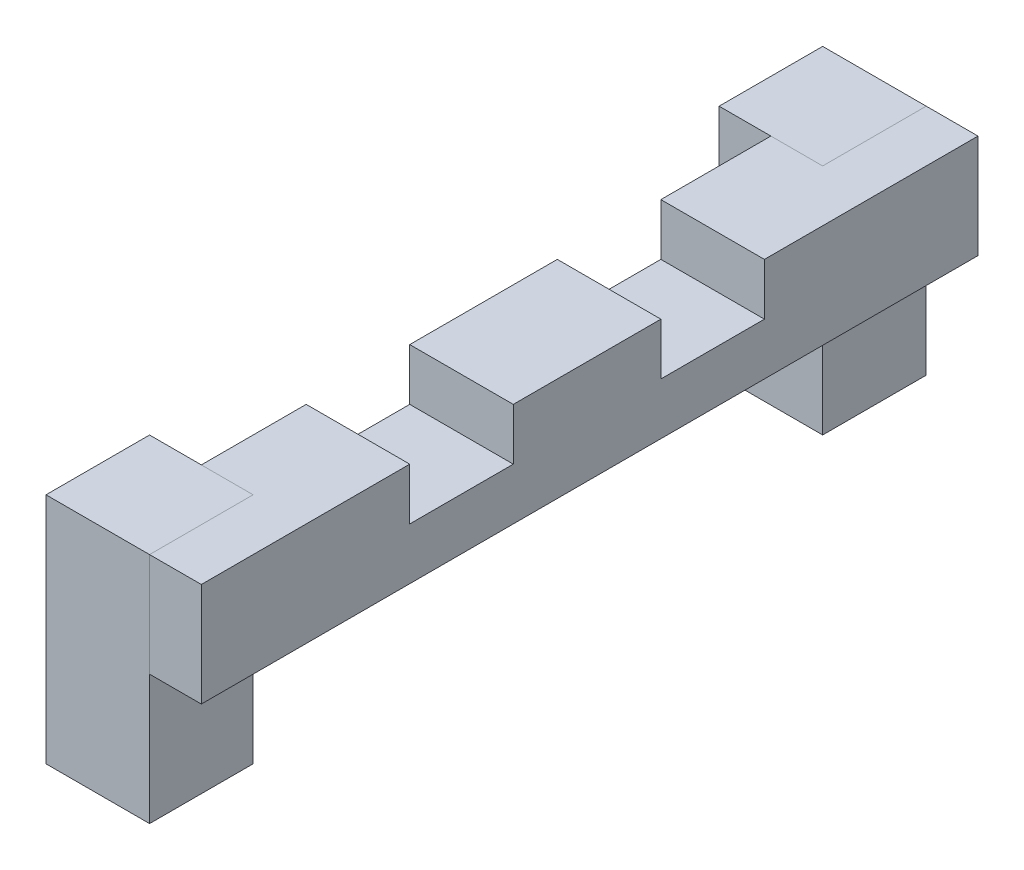
ISO-10303-21;
HEADER;
FILE_DESCRIPTION(('STEP AP214'),'2;1');
FILE_NAME('part.step','',(''),(''),'','','');
FILE_SCHEMA(('AUTOMOTIVE_DESIGN { 1 0 10303 214 1 1 1 1 }'));
ENDSEC;
DATA;
#1=APPLICATION_CONTEXT('core data for automotive mechanical design processes');
#2=APPLICATION_PROTOCOL_DEFINITION('international standard','automotive_design',2000,#1);
#3=PRODUCT_CONTEXT('',#1,'mechanical');
#4=PRODUCT('Part','Part','',(#3));
#5=PRODUCT_RELATED_PRODUCT_CATEGORY('part','',(#4));
#6=PRODUCT_DEFINITION_FORMATION('','',#4);
#7=PRODUCT_DEFINITION_CONTEXT('part definition',#1,'design');
#8=PRODUCT_DEFINITION('design','',#6,#7);
#9=PRODUCT_DEFINITION_SHAPE('','',#8);
#10=(LENGTH_UNIT() NAMED_UNIT(*) SI_UNIT(.MILLI.,.METRE.));
#11=(NAMED_UNIT(*) PLANE_ANGLE_UNIT() SI_UNIT($,.RADIAN.));
#12=(NAMED_UNIT(*) SI_UNIT($,.STERADIAN.) SOLID_ANGLE_UNIT());
#13=UNCERTAINTY_MEASURE_WITH_UNIT(LENGTH_MEASURE(1.E-05),#10,'distance_accuracy_value','');
#14=(GEOMETRIC_REPRESENTATION_CONTEXT(3) GLOBAL_UNCERTAINTY_ASSIGNED_CONTEXT((#13)) GLOBAL_UNIT_ASSIGNED_CONTEXT((#10,
#11,#12)) REPRESENTATION_CONTEXT('',''));
#15=CARTESIAN_POINT('',(0.,0.,0.));
#16=DIRECTION('',(0.,0.,1.));
#17=DIRECTION('',(1.,0.,0.));
#18=AXIS2_PLACEMENT_3D('',#15,#16,#17);
#19=CARTESIAN_POINT('',(-20.,-50.,40.));
#20=DIRECTION('',(-1.,0.,0.));
#21=DIRECTION('',(0.,0.,1.));
#22=AXIS2_PLACEMENT_3D('',#19,#20,#21);
#23=PLANE('',#22);
#24=DIRECTION('',(0.,1.,0.));
#25=VECTOR('',#24,1.);
#26=CARTESIAN_POINT('',(-20.,-50.,0.));
#27=LINE('',#26,#25);
#28=CARTESIAN_POINT('',(-20.,-50.,0.));
#29=VERTEX_POINT('',#28);
#30=CARTESIAN_POINT('',(-20.,40.,0.));
#31=VERTEX_POINT('',#30);
#32=EDGE_CURVE('E107',#29,#31,#27,.T.);
#33=ORIENTED_EDGE('',*,*,#32,.F.);
#34=DIRECTION('',(0.,0.,-1.));
#35=VECTOR('',#34,1.);
#36=CARTESIAN_POINT('',(-20.,-50.,40.));
#37=LINE('',#36,#35);
#38=CARTESIAN_POINT('',(-20.,-50.,40.));
#39=VERTEX_POINT('',#38);
#40=EDGE_CURVE('E12',#39,#29,#37,.T.);
#41=ORIENTED_EDGE('',*,*,#40,.F.);
#42=DIRECTION('',(0.,1.,0.));
#43=VECTOR('',#42,1.);
#44=CARTESIAN_POINT('',(-20.,-50.,40.));
#45=LINE('',#44,#43);
#46=CARTESIAN_POINT('',(-20.,40.,40.));
#47=VERTEX_POINT('',#46);
#48=EDGE_CURVE('E101',#39,#47,#45,.T.);
#49=ORIENTED_EDGE('',*,*,#48,.T.);
#50=DIRECTION('',(0.,0.,-1.));
#51=VECTOR('',#50,1.);
#52=CARTESIAN_POINT('',(-20.,40.,40.));
#53=LINE('',#52,#51);
#54=EDGE_CURVE('E46',#47,#31,#53,.T.);
#55=ORIENTED_EDGE('',*,*,#54,.T.);
#56=EDGE_LOOP('',(#33,#41,#49,#55));
#57=FACE_BOUND('',#56,.T.);
#58=ADVANCED_FACE('F43',(#57),#23,.T.);
#59=CARTESIAN_POINT('',(20.,-50.,40.));
#60=DIRECTION('',(0.,-1.,0.));
#61=DIRECTION('',(0.,0.,-1.));
#62=AXIS2_PLACEMENT_3D('',#59,#60,#61);
#63=PLANE('',#62);
#64=DIRECTION('',(-1.,0.,0.));
#65=VECTOR('',#64,1.);
#66=CARTESIAN_POINT('',(20.,-50.,0.));
#67=LINE('',#66,#65);
#68=CARTESIAN_POINT('',(20.,-50.,0.));
#69=VERTEX_POINT('',#68);
#70=EDGE_CURVE('E103',#69,#29,#67,.T.);
#71=ORIENTED_EDGE('',*,*,#70,.F.);
#72=DIRECTION('',(0.,0.,-1.));
#73=VECTOR('',#72,1.);
#74=CARTESIAN_POINT('',(20.,-50.,40.));
#75=LINE('',#74,#73);
#76=CARTESIAN_POINT('',(20.,-50.,40.));
#77=VERTEX_POINT('',#76);
#78=EDGE_CURVE('E52',#77,#69,#75,.T.);
#79=ORIENTED_EDGE('',*,*,#78,.F.);
#80=DIRECTION('',(-1.,0.,0.));
#81=VECTOR('',#80,1.);
#82=CARTESIAN_POINT('',(20.,-50.,40.));
#83=LINE('',#82,#81);
#84=EDGE_CURVE('E98',#77,#39,#83,.T.);
#85=ORIENTED_EDGE('',*,*,#84,.T.);
#86=ORIENTED_EDGE('',*,*,#40,.T.);
#87=EDGE_LOOP('',(#71,#79,#85,#86));
#88=FACE_BOUND('',#87,.T.);
#89=ADVANCED_FACE('F117',(#88),#63,.T.);
#90=CARTESIAN_POINT('',(20.,40.,40.));
#91=DIRECTION('',(1.,0.,0.));
#92=DIRECTION('',(0.,1.,0.));
#93=AXIS2_PLACEMENT_3D('',#90,#91,#92);
#94=PLANE('',#93);
#95=DIRECTION('',(0.,-1.,0.));
#96=VECTOR('',#95,1.);
#97=CARTESIAN_POINT('',(20.,40.,0.));
#98=LINE('',#97,#96);
#99=CARTESIAN_POINT('',(20.,40.,0.));
#100=VERTEX_POINT('',#99);
#101=EDGE_CURVE('E93',#100,#69,#98,.T.);
#102=ORIENTED_EDGE('',*,*,#101,.F.);
#103=DIRECTION('',(0.,0.,-1.));
#104=VECTOR('',#103,1.);
#105=CARTESIAN_POINT('',(20.,40.,40.));
#106=LINE('',#105,#104);
#107=CARTESIAN_POINT('',(20.,40.,40.));
#108=VERTEX_POINT('',#107);
#109=EDGE_CURVE('E88',#108,#100,#106,.T.);
#110=ORIENTED_EDGE('',*,*,#109,.F.);
#111=DIRECTION('',(0.,-1.,0.));
#112=VECTOR('',#111,1.);
#113=CARTESIAN_POINT('',(20.,40.,40.));
#114=LINE('',#113,#112);
#115=EDGE_CURVE('E91',#108,#77,#114,.T.);
#116=ORIENTED_EDGE('',*,*,#115,.T.);
#117=ORIENTED_EDGE('',*,*,#78,.T.);
#118=EDGE_LOOP('',(#102,#110,#116,#117));
#119=FACE_BOUND('',#118,.T.);
#120=ADVANCED_FACE('F90',(#119),#94,.T.);
#121=CARTESIAN_POINT('',(-20.,40.,40.));
#122=DIRECTION('',(0.,1.,0.));
#123=DIRECTION('',(0.,0.,1.));
#124=AXIS2_PLACEMENT_3D('',#121,#122,#123);
#125=PLANE('',#124);
#126=DIRECTION('',(1.,0.,0.));
#127=VECTOR('',#126,1.);
#128=CARTESIAN_POINT('',(-20.,40.,0.));
#129=LINE('',#128,#127);
#130=EDGE_CURVE('E110',#31,#100,#129,.T.);
#131=ORIENTED_EDGE('',*,*,#130,.F.);
#132=ORIENTED_EDGE('',*,*,#54,.F.);
#133=DIRECTION('',(1.,0.,0.));
#134=VECTOR('',#133,1.);
#135=CARTESIAN_POINT('',(-20.,40.,40.));
#136=LINE('',#135,#134);
#137=EDGE_CURVE('E97',#47,#108,#136,.T.);
#138=ORIENTED_EDGE('',*,*,#137,.T.);
#139=ORIENTED_EDGE('',*,*,#109,.T.);
#140=EDGE_LOOP('',(#131,#132,#138,#139));
#141=FACE_BOUND('',#140,.T.);
#142=ADVANCED_FACE('F100',(#141),#125,.T.);
#143=CARTESIAN_POINT('',(0.,0.,40.));
#144=DIRECTION('',(0.,0.,-1.));
#145=DIRECTION('',(-1.,0.,0.));
#146=AXIS2_PLACEMENT_3D('',#143,#144,#145);
#147=PLANE('',#146);
#148=ORIENTED_EDGE('',*,*,#48,.F.);
#149=ORIENTED_EDGE('',*,*,#84,.F.);
#150=ORIENTED_EDGE('',*,*,#115,.F.);
#151=ORIENTED_EDGE('',*,*,#137,.F.);
#152=EDGE_LOOP('',(#148,#149,#150,#151));
#153=FACE_BOUND('',#152,.T.);
#154=ADVANCED_FACE('F96',(#153),#147,.F.);
#155=CARTESIAN_POINT('',(0.,0.,0.));
#156=DIRECTION('',(0.,0.,-1.));
#157=DIRECTION('',(-1.,0.,0.));
#158=AXIS2_PLACEMENT_3D('',#155,#156,#157);
#159=PLANE('',#158);
#160=ORIENTED_EDGE('',*,*,#32,.T.);
#161=ORIENTED_EDGE('',*,*,#130,.T.);
#162=ORIENTED_EDGE('',*,*,#101,.T.);
#163=ORIENTED_EDGE('',*,*,#70,.T.);
#164=EDGE_LOOP('',(#160,#161,#162,#163));
#165=FACE_BOUND('',#164,.T.);
#166=ADVANCED_FACE('F116',(#165),#159,.T.);
#167=CLOSED_SHELL('',(#58,#89,#120,#142,#154,#166));
#168=MANIFOLD_SOLID_BREP('B2',#167);
#169=CARTESIAN_POINT('',(-20.,40.,260.));
#170=DIRECTION('',(0.,1.,0.));
#171=DIRECTION('',(0.,0.,1.));
#172=AXIS2_PLACEMENT_3D('',#169,#170,#171);
#173=PLANE('',#172);
#174=DIRECTION('',(-1.,0.,0.));
#175=VECTOR('',#174,1.);
#176=CARTESIAN_POINT('',(-20.,40.,300.));
#177=LINE('',#176,#175);
#178=CARTESIAN_POINT('',(20.,40.,300.));
#179=VERTEX_POINT('',#178);
#180=CARTESIAN_POINT('',(-20.,40.,300.));
#181=VERTEX_POINT('',#180);
#182=EDGE_CURVE('E239',#179,#181,#177,.T.);
#183=ORIENTED_EDGE('',*,*,#182,.F.);
#184=DIRECTION('',(0.,0.,1.));
#185=VECTOR('',#184,1.);
#186=CARTESIAN_POINT('',(20.,40.,260.));
#187=LINE('',#186,#185);
#188=CARTESIAN_POINT('',(20.,40.,260.));
#189=VERTEX_POINT('',#188);
#190=EDGE_CURVE('E41',#189,#179,#187,.T.);
#191=ORIENTED_EDGE('',*,*,#190,.F.);
#192=DIRECTION('',(-1.,0.,0.));
#193=VECTOR('',#192,1.);
#194=CARTESIAN_POINT('',(-20.,40.,260.));
#195=LINE('',#194,#193);
#196=CARTESIAN_POINT('',(-20.,40.,260.));
#197=VERTEX_POINT('',#196);
#198=EDGE_CURVE('E233',#189,#197,#195,.T.);
#199=ORIENTED_EDGE('',*,*,#198,.T.);
#200=DIRECTION('',(0.,0.,1.));
#201=VECTOR('',#200,1.);
#202=CARTESIAN_POINT('',(-20.,40.,260.));
#203=LINE('',#202,#201);
#204=EDGE_CURVE('E178',#197,#181,#203,.T.);
#205=ORIENTED_EDGE('',*,*,#204,.T.);
#206=EDGE_LOOP('',(#183,#191,#199,#205));
#207=FACE_BOUND('',#206,.T.);
#208=ADVANCED_FACE('F175',(#207),#173,.T.);
#209=CARTESIAN_POINT('',(20.,40.,260.));
#210=DIRECTION('',(1.,0.,0.));
#211=DIRECTION('',(0.,1.,0.));
#212=AXIS2_PLACEMENT_3D('',#209,#210,#211);
#213=PLANE('',#212);
#214=DIRECTION('',(0.,1.,0.));
#215=VECTOR('',#214,1.);
#216=CARTESIAN_POINT('',(20.,40.,300.));
#217=LINE('',#216,#215);
#218=CARTESIAN_POINT('',(20.,-50.,300.));
#219=VERTEX_POINT('',#218);
#220=EDGE_CURVE('E235',#219,#179,#217,.T.);
#221=ORIENTED_EDGE('',*,*,#220,.F.);
#222=DIRECTION('',(0.,0.,1.));
#223=VECTOR('',#222,1.);
#224=CARTESIAN_POINT('',(20.,-50.,260.));
#225=LINE('',#224,#223);
#226=CARTESIAN_POINT('',(20.,-50.,260.));
#227=VERTEX_POINT('',#226);
#228=EDGE_CURVE('E184',#227,#219,#225,.T.);
#229=ORIENTED_EDGE('',*,*,#228,.F.);
#230=DIRECTION('',(0.,1.,0.));
#231=VECTOR('',#230,1.);
#232=CARTESIAN_POINT('',(20.,40.,260.));
#233=LINE('',#232,#231);
#234=EDGE_CURVE('E230',#227,#189,#233,.T.);
#235=ORIENTED_EDGE('',*,*,#234,.T.);
#236=ORIENTED_EDGE('',*,*,#190,.T.);
#237=EDGE_LOOP('',(#221,#229,#235,#236));
#238=FACE_BOUND('',#237,.T.);
#239=ADVANCED_FACE('F249',(#238),#213,.T.);
#240=CARTESIAN_POINT('',(20.,-50.,260.));
#241=DIRECTION('',(0.,-1.,0.));
#242=DIRECTION('',(0.,0.,-1.));
#243=AXIS2_PLACEMENT_3D('',#240,#241,#242);
#244=PLANE('',#243);
#245=DIRECTION('',(1.,0.,0.));
#246=VECTOR('',#245,1.);
#247=CARTESIAN_POINT('',(20.,-50.,300.));
#248=LINE('',#247,#246);
#249=CARTESIAN_POINT('',(-20.,-50.,300.));
#250=VERTEX_POINT('',#249);
#251=EDGE_CURVE('E225',#250,#219,#248,.T.);
#252=ORIENTED_EDGE('',*,*,#251,.F.);
#253=DIRECTION('',(0.,0.,1.));
#254=VECTOR('',#253,1.);
#255=CARTESIAN_POINT('',(-20.,-50.,260.));
#256=LINE('',#255,#254);
#257=CARTESIAN_POINT('',(-20.,-50.,260.));
#258=VERTEX_POINT('',#257);
#259=EDGE_CURVE('E220',#258,#250,#256,.T.);
#260=ORIENTED_EDGE('',*,*,#259,.F.);
#261=DIRECTION('',(1.,0.,0.));
#262=VECTOR('',#261,1.);
#263=CARTESIAN_POINT('',(20.,-50.,260.));
#264=LINE('',#263,#262);
#265=EDGE_CURVE('E223',#258,#227,#264,.T.);
#266=ORIENTED_EDGE('',*,*,#265,.T.);
#267=ORIENTED_EDGE('',*,*,#228,.T.);
#268=EDGE_LOOP('',(#252,#260,#266,#267));
#269=FACE_BOUND('',#268,.T.);
#270=ADVANCED_FACE('F222',(#269),#244,.T.);
#271=CARTESIAN_POINT('',(-20.,-50.,260.));
#272=DIRECTION('',(-1.,0.,0.));
#273=DIRECTION('',(0.,0.,1.));
#274=AXIS2_PLACEMENT_3D('',#271,#272,#273);
#275=PLANE('',#274);
#276=DIRECTION('',(0.,-1.,0.));
#277=VECTOR('',#276,1.);
#278=CARTESIAN_POINT('',(-20.,-50.,300.));
#279=LINE('',#278,#277);
#280=EDGE_CURVE('E242',#181,#250,#279,.T.);
#281=ORIENTED_EDGE('',*,*,#280,.F.);
#282=ORIENTED_EDGE('',*,*,#204,.F.);
#283=DIRECTION('',(0.,-1.,0.));
#284=VECTOR('',#283,1.);
#285=CARTESIAN_POINT('',(-20.,-50.,260.));
#286=LINE('',#285,#284);
#287=EDGE_CURVE('E229',#197,#258,#286,.T.);
#288=ORIENTED_EDGE('',*,*,#287,.T.);
#289=ORIENTED_EDGE('',*,*,#259,.T.);
#290=EDGE_LOOP('',(#281,#282,#288,#289));
#291=FACE_BOUND('',#290,.T.);
#292=ADVANCED_FACE('F232',(#291),#275,.T.);
#293=CARTESIAN_POINT('',(0.,0.,260.));
#294=DIRECTION('',(0.,0.,-1.));
#295=DIRECTION('',(-1.,0.,0.));
#296=AXIS2_PLACEMENT_3D('',#293,#294,#295);
#297=PLANE('',#296);
#298=ORIENTED_EDGE('',*,*,#198,.F.);
#299=ORIENTED_EDGE('',*,*,#234,.F.);
#300=ORIENTED_EDGE('',*,*,#265,.F.);
#301=ORIENTED_EDGE('',*,*,#287,.F.);
#302=EDGE_LOOP('',(#298,#299,#300,#301));
#303=FACE_BOUND('',#302,.T.);
#304=ADVANCED_FACE('F228',(#303),#297,.T.);
#305=CARTESIAN_POINT('',(0.,0.,300.));
#306=DIRECTION('',(0.,0.,-1.));
#307=DIRECTION('',(-1.,0.,0.));
#308=AXIS2_PLACEMENT_3D('',#305,#306,#307);
#309=PLANE('',#308);
#310=ORIENTED_EDGE('',*,*,#182,.T.);
#311=ORIENTED_EDGE('',*,*,#280,.T.);
#312=ORIENTED_EDGE('',*,*,#251,.T.);
#313=ORIENTED_EDGE('',*,*,#220,.T.);
#314=EDGE_LOOP('',(#310,#311,#312,#313));
#315=FACE_BOUND('',#314,.T.);
#316=ADVANCED_FACE('F248',(#315),#309,.F.);
#317=CLOSED_SHELL('',(#208,#239,#270,#292,#304,#316));
#318=MANIFOLD_SOLID_BREP('B6',#317);
#319=CARTESIAN_POINT('',(0.,40.,0.));
#320=DIRECTION('',(1.,0.,0.));
#321=DIRECTION('',(0.,0.,-1.));
#322=AXIS2_PLACEMENT_3D('',#319,#320,#321);
#323=PLANE('',#322);
#324=DIRECTION('',(0.,1.,0.));
#325=VECTOR('',#324,1.);
#326=CARTESIAN_POINT('',(0.,0.,40.));
#327=LINE('',#326,#325);
#328=CARTESIAN_POINT('',(0.,0.,40.));
#329=VERTEX_POINT('',#328);
#330=CARTESIAN_POINT('',(0.,40.,40.));
#331=VERTEX_POINT('',#330);
#332=EDGE_CURVE('E409',#329,#331,#327,.T.);
#333=ORIENTED_EDGE('',*,*,#332,.F.);
#334=DIRECTION('',(0.,0.,1.));
#335=VECTOR('',#334,1.);
#336=CARTESIAN_POINT('',(0.,0.,0.));
#337=LINE('',#336,#335);
#338=CARTESIAN_POINT('',(0.,0.,260.));
#339=VERTEX_POINT('',#338);
#340=EDGE_CURVE('E320',#329,#339,#337,.T.);
#341=ORIENTED_EDGE('',*,*,#340,.T.);
#342=DIRECTION('',(0.,-1.,0.));
#343=VECTOR('',#342,1.);
#344=CARTESIAN_POINT('',(0.,40.,260.));
#345=LINE('',#344,#343);
#346=CARTESIAN_POINT('',(0.,40.,260.));
#347=VERTEX_POINT('',#346);
#348=EDGE_CURVE('E483',#347,#339,#345,.T.);
#349=ORIENTED_EDGE('',*,*,#348,.F.);
#350=DIRECTION('',(0.,0.,1.));
#351=VECTOR('',#350,1.);
#352=CARTESIAN_POINT('',(0.,40.,0.));
#353=LINE('',#352,#351);
#354=CARTESIAN_POINT('',(0.,40.,219.5));
#355=VERTEX_POINT('',#354);
#356=EDGE_CURVE('E433',#355,#347,#353,.T.);
#357=ORIENTED_EDGE('',*,*,#356,.F.);
#358=DIRECTION('',(0.,1.,0.));
#359=VECTOR('',#358,1.);
#360=CARTESIAN_POINT('',(0.,20.,219.5));
#361=LINE('',#360,#359);
#362=CARTESIAN_POINT('',(0.,20.,219.5));
#363=VERTEX_POINT('',#362);
#364=EDGE_CURVE('E540',#363,#355,#361,.T.);
#365=ORIENTED_EDGE('',*,*,#364,.F.);
#366=DIRECTION('',(0.,0.,1.));
#367=VECTOR('',#366,1.);
#368=CARTESIAN_POINT('',(0.,20.,179.5));
#369=LINE('',#368,#367);
#370=CARTESIAN_POINT('',(0.,20.,179.5));
#371=VERTEX_POINT('',#370);
#372=EDGE_CURVE('E528',#371,#363,#369,.T.);
#373=ORIENTED_EDGE('',*,*,#372,.F.);
#374=DIRECTION('',(0.,1.,0.));
#375=VECTOR('',#374,1.);
#376=CARTESIAN_POINT('',(0.,20.,179.5));
#377=LINE('',#376,#375);
#378=CARTESIAN_POINT('',(0.,40.,179.5));
#379=VERTEX_POINT('',#378);
#380=EDGE_CURVE('E519',#371,#379,#377,.T.);
#381=ORIENTED_EDGE('',*,*,#380,.T.);
#382=CARTESIAN_POINT('',(0.,40.,122.5));
#383=VERTEX_POINT('',#382);
#384=EDGE_CURVE('E431',#383,#379,#353,.T.);
#385=ORIENTED_EDGE('',*,*,#384,.F.);
#386=DIRECTION('',(0.,1.,0.));
#387=VECTOR('',#386,1.);
#388=CARTESIAN_POINT('',(0.,20.,122.5));
#389=LINE('',#388,#387);
#390=CARTESIAN_POINT('',(0.,20.,122.5));
#391=VERTEX_POINT('',#390);
#392=EDGE_CURVE('E516',#391,#383,#389,.T.);
#393=ORIENTED_EDGE('',*,*,#392,.F.);
#394=DIRECTION('',(0.,0.,1.));
#395=VECTOR('',#394,1.);
#396=CARTESIAN_POINT('',(0.,20.,82.5));
#397=LINE('',#396,#395);
#398=CARTESIAN_POINT('',(0.,20.,82.5));
#399=VERTEX_POINT('',#398);
#400=EDGE_CURVE('E504',#399,#391,#397,.T.);
#401=ORIENTED_EDGE('',*,*,#400,.F.);
#402=DIRECTION('',(0.,1.,0.));
#403=VECTOR('',#402,1.);
#404=CARTESIAN_POINT('',(0.,20.,82.5));
#405=LINE('',#404,#403);
#406=CARTESIAN_POINT('',(0.,40.,82.5));
#407=VERTEX_POINT('',#406);
#408=EDGE_CURVE('E429',#399,#407,#405,.T.);
#409=ORIENTED_EDGE('',*,*,#408,.T.);
#410=EDGE_CURVE('E422',#331,#407,#353,.T.);
#411=ORIENTED_EDGE('',*,*,#410,.F.);
#412=EDGE_LOOP('',(#333,#341,#349,#357,#365,#373,#381,#385,#393,#401,#409,#411));
#413=FACE_BOUND('',#412,.T.);
#414=ADVANCED_FACE('F298',(#413),#323,.F.);
#415=CARTESIAN_POINT('',(0.,40.,0.));
#416=DIRECTION('',(0.,1.,0.));
#417=DIRECTION('',(0.,0.,1.));
#418=AXIS2_PLACEMENT_3D('',#415,#416,#417);
#419=PLANE('',#418);
#420=DIRECTION('',(0.,0.,-1.));
#421=VECTOR('',#420,1.);
#422=CARTESIAN_POINT('',(20.,40.,40.));
#423=LINE('',#422,#421);
#424=CARTESIAN_POINT('',(20.,40.,40.));
#425=VERTEX_POINT('',#424);
#426=CARTESIAN_POINT('',(20.,40.,0.));
#427=VERTEX_POINT('',#426);
#428=EDGE_CURVE('E425',#425,#427,#423,.T.);
#429=ORIENTED_EDGE('',*,*,#428,.F.);
#430=DIRECTION('',(1.,0.,0.));
#431=VECTOR('',#430,1.);
#432=CARTESIAN_POINT('',(0.,40.,40.));
#433=LINE('',#432,#431);
#434=EDGE_CURVE('E412',#331,#425,#433,.T.);
#435=ORIENTED_EDGE('',*,*,#434,.F.);
#436=ORIENTED_EDGE('',*,*,#410,.T.);
#437=DIRECTION('',(-1.,0.,0.));
#438=VECTOR('',#437,1.);
#439=CARTESIAN_POINT('',(0.,40.,82.5));
#440=LINE('',#439,#438);
#441=CARTESIAN_POINT('',(40.,40.,82.5));
#442=VERTEX_POINT('',#441);
#443=EDGE_CURVE('E508',#442,#407,#440,.T.);
#444=ORIENTED_EDGE('',*,*,#443,.F.);
#445=DIRECTION('',(0.,0.,-1.));
#446=VECTOR('',#445,1.);
#447=CARTESIAN_POINT('',(40.,40.,0.));
#448=LINE('',#447,#446);
#449=CARTESIAN_POINT('',(40.,40.,0.));
#450=VERTEX_POINT('',#449);
#451=EDGE_CURVE('E434',#442,#450,#448,.T.);
#452=ORIENTED_EDGE('',*,*,#451,.T.);
#453=DIRECTION('',(-1.,0.,0.));
#454=VECTOR('',#453,1.);
#455=CARTESIAN_POINT('',(0.,40.,0.));
#456=LINE('',#455,#454);
#457=EDGE_CURVE('E454',#450,#427,#456,.T.);
#458=ORIENTED_EDGE('',*,*,#457,.T.);
#459=EDGE_LOOP('',(#429,#435,#436,#444,#452,#458));
#460=FACE_BOUND('',#459,.T.);
#461=ADVANCED_FACE('F420',(#460),#419,.T.);
#462=DIRECTION('',(1.,0.,0.));
#463=VECTOR('',#462,1.);
#464=CARTESIAN_POINT('',(0.,40.,122.5));
#465=LINE('',#464,#463);
#466=CARTESIAN_POINT('',(40.,40.,122.5));
#467=VERTEX_POINT('',#466);
#468=EDGE_CURVE('E517',#383,#467,#465,.T.);
#469=ORIENTED_EDGE('',*,*,#468,.F.);
#470=ORIENTED_EDGE('',*,*,#384,.T.);
#471=DIRECTION('',(-1.,0.,0.));
#472=VECTOR('',#471,1.);
#473=CARTESIAN_POINT('',(0.,40.,179.5));
#474=LINE('',#473,#472);
#475=CARTESIAN_POINT('',(40.,40.,179.5));
#476=VERTEX_POINT('',#475);
#477=EDGE_CURVE('E532',#476,#379,#474,.T.);
#478=ORIENTED_EDGE('',*,*,#477,.F.);
#479=EDGE_CURVE('E460',#476,#467,#448,.T.);
#480=ORIENTED_EDGE('',*,*,#479,.T.);
#481=EDGE_LOOP('',(#469,#470,#478,#480));
#482=FACE_BOUND('',#481,.T.);
#483=ADVANCED_FACE('F574',(#482),#419,.T.);
#484=CARTESIAN_POINT('',(0.,40.,300.));
#485=DIRECTION('',(0.,0.,-1.));
#486=DIRECTION('',(-1.,0.,0.));
#487=AXIS2_PLACEMENT_3D('',#484,#485,#486);
#488=PLANE('',#487);
#489=DIRECTION('',(1.,0.,0.));
#490=VECTOR('',#489,1.);
#491=CARTESIAN_POINT('',(0.,40.,300.));
#492=LINE('',#491,#490);
#493=CARTESIAN_POINT('',(20.,40.,300.));
#494=VERTEX_POINT('',#493);
#495=CARTESIAN_POINT('',(40.,40.,300.));
#496=VERTEX_POINT('',#495);
#497=EDGE_CURVE('E430',#494,#496,#492,.T.);
#498=ORIENTED_EDGE('',*,*,#497,.F.);
#499=DIRECTION('',(0.,1.,0.));
#500=VECTOR('',#499,1.);
#501=CARTESIAN_POINT('',(20.,40.,300.));
#502=LINE('',#501,#500);
#503=CARTESIAN_POINT('',(20.,0.,300.));
#504=VERTEX_POINT('',#503);
#505=EDGE_CURVE('E470',#504,#494,#502,.T.);
#506=ORIENTED_EDGE('',*,*,#505,.F.);
#507=DIRECTION('',(1.,0.,0.));
#508=VECTOR('',#507,1.);
#509=CARTESIAN_POINT('',(0.,0.,300.));
#510=LINE('',#509,#508);
#511=CARTESIAN_POINT('',(40.,0.,300.));
#512=VERTEX_POINT('',#511);
#513=EDGE_CURVE('E451',#504,#512,#510,.T.);
#514=ORIENTED_EDGE('',*,*,#513,.T.);
#515=DIRECTION('',(0.,-1.,0.));
#516=VECTOR('',#515,1.);
#517=CARTESIAN_POINT('',(40.,40.,300.));
#518=LINE('',#517,#516);
#519=EDGE_CURVE('E173',#496,#512,#518,.T.);
#520=ORIENTED_EDGE('',*,*,#519,.F.);
#521=EDGE_LOOP('',(#498,#506,#514,#520));
#522=FACE_BOUND('',#521,.T.);
#523=ADVANCED_FACE('F468',(#522),#488,.F.);
#524=CARTESIAN_POINT('',(40.,40.,0.));
#525=DIRECTION('',(-1.,0.,0.));
#526=DIRECTION('',(0.,0.,1.));
#527=AXIS2_PLACEMENT_3D('',#524,#525,#526);
#528=PLANE('',#527);
#529=ORIENTED_EDGE('',*,*,#451,.F.);
#530=DIRECTION('',(0.,1.,0.));
#531=VECTOR('',#530,1.);
#532=CARTESIAN_POINT('',(40.,20.,82.5));
#533=LINE('',#532,#531);
#534=CARTESIAN_POINT('',(40.,20.,82.5));
#535=VERTEX_POINT('',#534);
#536=EDGE_CURVE('E522',#535,#442,#533,.T.);
#537=ORIENTED_EDGE('',*,*,#536,.F.);
#538=DIRECTION('',(0.,0.,-1.));
#539=VECTOR('',#538,1.);
#540=CARTESIAN_POINT('',(40.,20.,82.5));
#541=LINE('',#540,#539);
#542=CARTESIAN_POINT('',(40.,20.,122.5));
#543=VERTEX_POINT('',#542);
#544=EDGE_CURVE('E511',#543,#535,#541,.T.);
#545=ORIENTED_EDGE('',*,*,#544,.F.);
#546=DIRECTION('',(0.,1.,0.));
#547=VECTOR('',#546,1.);
#548=CARTESIAN_POINT('',(40.,20.,122.5));
#549=LINE('',#548,#547);
#550=EDGE_CURVE('E524',#543,#467,#549,.T.);
#551=ORIENTED_EDGE('',*,*,#550,.T.);
#552=ORIENTED_EDGE('',*,*,#479,.F.);
#553=DIRECTION('',(0.,1.,0.));
#554=VECTOR('',#553,1.);
#555=CARTESIAN_POINT('',(40.,20.,179.5));
#556=LINE('',#555,#554);
#557=CARTESIAN_POINT('',(40.,20.,179.5));
#558=VERTEX_POINT('',#557);
#559=EDGE_CURVE('E545',#558,#476,#556,.T.);
#560=ORIENTED_EDGE('',*,*,#559,.F.);
#561=DIRECTION('',(0.,0.,-1.));
#562=VECTOR('',#561,1.);
#563=CARTESIAN_POINT('',(40.,20.,179.5));
#564=LINE('',#563,#562);
#565=CARTESIAN_POINT('',(40.,20.,219.5));
#566=VERTEX_POINT('',#565);
#567=EDGE_CURVE('E535',#566,#558,#564,.T.);
#568=ORIENTED_EDGE('',*,*,#567,.F.);
#569=DIRECTION('',(0.,1.,0.));
#570=VECTOR('',#569,1.);
#571=CARTESIAN_POINT('',(40.,20.,219.5));
#572=LINE('',#571,#570);
#573=CARTESIAN_POINT('',(40.,40.,219.5));
#574=VERTEX_POINT('',#573);
#575=EDGE_CURVE('E547',#566,#574,#572,.T.);
#576=ORIENTED_EDGE('',*,*,#575,.T.);
#577=EDGE_CURVE('E457',#496,#574,#448,.T.);
#578=ORIENTED_EDGE('',*,*,#577,.F.);
#579=ORIENTED_EDGE('',*,*,#519,.T.);
#580=DIRECTION('',(0.,0.,-1.));
#581=VECTOR('',#580,1.);
#582=CARTESIAN_POINT('',(40.,0.,0.));
#583=LINE('',#582,#581);
#584=CARTESIAN_POINT('',(40.,0.,0.));
#585=VERTEX_POINT('',#584);
#586=EDGE_CURVE('E445',#512,#585,#583,.T.);
#587=ORIENTED_EDGE('',*,*,#586,.T.);
#588=DIRECTION('',(0.,-1.,0.));
#589=VECTOR('',#588,1.);
#590=CARTESIAN_POINT('',(40.,40.,0.));
#591=LINE('',#590,#589);
#592=EDGE_CURVE('E305',#450,#585,#591,.T.);
#593=ORIENTED_EDGE('',*,*,#592,.F.);
#594=EDGE_LOOP('',(#529,#537,#545,#551,#552,#560,#568,#576,#578,#579,#587,#593));
#595=FACE_BOUND('',#594,.T.);
#596=ADVANCED_FACE('F476',(#595),#528,.F.);
#597=CARTESIAN_POINT('',(0.,40.,0.));
#598=DIRECTION('',(0.,0.,1.));
#599=DIRECTION('',(1.,0.,0.));
#600=AXIS2_PLACEMENT_3D('',#597,#598,#599);
#601=PLANE('',#600);
#602=DIRECTION('',(-1.,0.,0.));
#603=VECTOR('',#602,1.);
#604=CARTESIAN_POINT('',(0.,0.,0.));
#605=LINE('',#604,#603);
#606=CARTESIAN_POINT('',(20.,0.,0.));
#607=VERTEX_POINT('',#606);
#608=EDGE_CURVE('E439',#585,#607,#605,.T.);
#609=ORIENTED_EDGE('',*,*,#608,.T.);
#610=DIRECTION('',(0.,-1.,0.));
#611=VECTOR('',#610,1.);
#612=CARTESIAN_POINT('',(20.,40.,0.));
#613=LINE('',#612,#611);
#614=EDGE_CURVE('E417',#427,#607,#613,.T.);
#615=ORIENTED_EDGE('',*,*,#614,.F.);
#616=ORIENTED_EDGE('',*,*,#457,.F.);
#617=ORIENTED_EDGE('',*,*,#592,.T.);
#618=EDGE_LOOP('',(#609,#615,#616,#617));
#619=FACE_BOUND('',#618,.T.);
#620=ADVANCED_FACE('F583',(#619),#601,.F.);
#621=DIRECTION('',(0.,0.,1.));
#622=VECTOR('',#621,1.);
#623=CARTESIAN_POINT('',(20.,40.,260.));
#624=LINE('',#623,#622);
#625=CARTESIAN_POINT('',(20.,40.,260.));
#626=VERTEX_POINT('',#625);
#627=EDGE_CURVE('E499',#626,#494,#624,.T.);
#628=ORIENTED_EDGE('',*,*,#627,.T.);
#629=ORIENTED_EDGE('',*,*,#497,.T.);
#630=ORIENTED_EDGE('',*,*,#577,.T.);
#631=DIRECTION('',(1.,0.,0.));
#632=VECTOR('',#631,1.);
#633=CARTESIAN_POINT('',(0.,40.,219.5));
#634=LINE('',#633,#632);
#635=EDGE_CURVE('E502',#355,#574,#634,.T.);
#636=ORIENTED_EDGE('',*,*,#635,.F.);
#637=ORIENTED_EDGE('',*,*,#356,.T.);
#638=DIRECTION('',(-1.,0.,0.));
#639=VECTOR('',#638,1.);
#640=CARTESIAN_POINT('',(20.,40.,260.));
#641=LINE('',#640,#639);
#642=EDGE_CURVE('E496',#626,#347,#641,.T.);
#643=ORIENTED_EDGE('',*,*,#642,.F.);
#644=EDGE_LOOP('',(#628,#629,#630,#636,#637,#643));
#645=FACE_BOUND('',#644,.T.);
#646=ADVANCED_FACE('F552',(#645),#419,.T.);
#647=CARTESIAN_POINT('',(0.,0.,0.));
#648=DIRECTION('',(0.,1.,0.));
#649=DIRECTION('',(0.,0.,1.));
#650=AXIS2_PLACEMENT_3D('',#647,#648,#649);
#651=PLANE('',#650);
#652=DIRECTION('',(-1.,0.,0.));
#653=VECTOR('',#652,1.);
#654=CARTESIAN_POINT('',(20.,0.,40.));
#655=LINE('',#654,#653);
#656=CARTESIAN_POINT('',(20.,0.,40.));
#657=VERTEX_POINT('',#656);
#658=EDGE_CURVE('E415',#657,#329,#655,.T.);
#659=ORIENTED_EDGE('',*,*,#658,.F.);
#660=DIRECTION('',(0.,0.,-1.));
#661=VECTOR('',#660,1.);
#662=CARTESIAN_POINT('',(20.,0.,40.));
#663=LINE('',#662,#661);
#664=EDGE_CURVE('E480',#657,#607,#663,.T.);
#665=ORIENTED_EDGE('',*,*,#664,.T.);
#666=ORIENTED_EDGE('',*,*,#608,.F.);
#667=ORIENTED_EDGE('',*,*,#586,.F.);
#668=ORIENTED_EDGE('',*,*,#513,.F.);
#669=DIRECTION('',(0.,0.,1.));
#670=VECTOR('',#669,1.);
#671=CARTESIAN_POINT('',(20.,0.,260.));
#672=LINE('',#671,#670);
#673=CARTESIAN_POINT('',(20.,0.,260.));
#674=VERTEX_POINT('',#673);
#675=EDGE_CURVE('E497',#674,#504,#672,.T.);
#676=ORIENTED_EDGE('',*,*,#675,.F.);
#677=DIRECTION('',(1.,0.,0.));
#678=VECTOR('',#677,1.);
#679=CARTESIAN_POINT('',(0.,0.,260.));
#680=LINE('',#679,#678);
#681=EDGE_CURVE('E490',#339,#674,#680,.T.);
#682=ORIENTED_EDGE('',*,*,#681,.F.);
#683=ORIENTED_EDGE('',*,*,#340,.F.);
#684=EDGE_LOOP('',(#659,#665,#666,#667,#668,#676,#682,#683));
#685=FACE_BOUND('',#684,.T.);
#686=ADVANCED_FACE('F478',(#685),#651,.F.);
#687=CARTESIAN_POINT('',(0.,20.,179.5));
#688=DIRECTION('',(0.,0.,-1.));
#689=DIRECTION('',(-1.,0.,0.));
#690=AXIS2_PLACEMENT_3D('',#687,#688,#689);
#691=PLANE('',#690);
#692=ORIENTED_EDGE('',*,*,#477,.T.);
#693=ORIENTED_EDGE('',*,*,#380,.F.);
#694=DIRECTION('',(-1.,0.,0.));
#695=VECTOR('',#694,1.);
#696=CARTESIAN_POINT('',(0.,20.,179.5));
#697=LINE('',#696,#695);
#698=EDGE_CURVE('E537',#558,#371,#697,.T.);
#699=ORIENTED_EDGE('',*,*,#698,.F.);
#700=ORIENTED_EDGE('',*,*,#559,.T.);
#701=EDGE_LOOP('',(#692,#693,#699,#700));
#702=FACE_BOUND('',#701,.T.);
#703=ADVANCED_FACE('F588',(#702),#691,.F.);
#704=CARTESIAN_POINT('',(0.,20.,219.5));
#705=DIRECTION('',(0.,0.,1.));
#706=DIRECTION('',(1.,0.,0.));
#707=AXIS2_PLACEMENT_3D('',#704,#705,#706);
#708=PLANE('',#707);
#709=ORIENTED_EDGE('',*,*,#635,.T.);
#710=ORIENTED_EDGE('',*,*,#575,.F.);
#711=DIRECTION('',(1.,0.,0.));
#712=VECTOR('',#711,1.);
#713=CARTESIAN_POINT('',(0.,20.,219.5));
#714=LINE('',#713,#712);
#715=EDGE_CURVE('E531',#363,#566,#714,.T.);
#716=ORIENTED_EDGE('',*,*,#715,.F.);
#717=ORIENTED_EDGE('',*,*,#364,.T.);
#718=EDGE_LOOP('',(#709,#710,#716,#717));
#719=FACE_BOUND('',#718,.T.);
#720=ADVANCED_FACE('F550',(#719),#708,.F.);
#721=CARTESIAN_POINT('',(0.,20.,0.));
#722=DIRECTION('',(0.,1.,0.));
#723=DIRECTION('',(0.,0.,1.));
#724=AXIS2_PLACEMENT_3D('',#721,#722,#723);
#725=PLANE('',#724);
#726=ORIENTED_EDGE('',*,*,#372,.T.);
#727=ORIENTED_EDGE('',*,*,#715,.T.);
#728=ORIENTED_EDGE('',*,*,#567,.T.);
#729=ORIENTED_EDGE('',*,*,#698,.T.);
#730=EDGE_LOOP('',(#726,#727,#728,#729));
#731=FACE_BOUND('',#730,.T.);
#732=ADVANCED_FACE('F626',(#731),#725,.T.);
#733=CARTESIAN_POINT('',(0.,20.,82.5));
#734=DIRECTION('',(0.,0.,-1.));
#735=DIRECTION('',(-1.,0.,0.));
#736=AXIS2_PLACEMENT_3D('',#733,#734,#735);
#737=PLANE('',#736);
#738=ORIENTED_EDGE('',*,*,#443,.T.);
#739=ORIENTED_EDGE('',*,*,#408,.F.);
#740=DIRECTION('',(-1.,0.,0.));
#741=VECTOR('',#740,1.);
#742=CARTESIAN_POINT('',(0.,20.,82.5));
#743=LINE('',#742,#741);
#744=EDGE_CURVE('E513',#535,#399,#743,.T.);
#745=ORIENTED_EDGE('',*,*,#744,.F.);
#746=ORIENTED_EDGE('',*,*,#536,.T.);
#747=EDGE_LOOP('',(#738,#739,#745,#746));
#748=FACE_BOUND('',#747,.T.);
#749=ADVANCED_FACE('F634',(#748),#737,.F.);
#750=CARTESIAN_POINT('',(0.,20.,122.5));
#751=DIRECTION('',(0.,0.,1.));
#752=DIRECTION('',(1.,0.,0.));
#753=AXIS2_PLACEMENT_3D('',#750,#751,#752);
#754=PLANE('',#753);
#755=ORIENTED_EDGE('',*,*,#468,.T.);
#756=ORIENTED_EDGE('',*,*,#550,.F.);
#757=DIRECTION('',(1.,0.,0.));
#758=VECTOR('',#757,1.);
#759=CARTESIAN_POINT('',(0.,20.,122.5));
#760=LINE('',#759,#758);
#761=EDGE_CURVE('E507',#391,#543,#760,.T.);
#762=ORIENTED_EDGE('',*,*,#761,.F.);
#763=ORIENTED_EDGE('',*,*,#392,.T.);
#764=EDGE_LOOP('',(#755,#756,#762,#763));
#765=FACE_BOUND('',#764,.T.);
#766=ADVANCED_FACE('F567',(#765),#754,.F.);
#767=CARTESIAN_POINT('',(0.,20.,0.));
#768=DIRECTION('',(0.,1.,0.));
#769=DIRECTION('',(0.,0.,1.));
#770=AXIS2_PLACEMENT_3D('',#767,#768,#769);
#771=PLANE('',#770);
#772=ORIENTED_EDGE('',*,*,#400,.T.);
#773=ORIENTED_EDGE('',*,*,#761,.T.);
#774=ORIENTED_EDGE('',*,*,#544,.T.);
#775=ORIENTED_EDGE('',*,*,#744,.T.);
#776=EDGE_LOOP('',(#772,#773,#774,#775));
#777=FACE_BOUND('',#776,.T.);
#778=ADVANCED_FACE('F559',(#777),#771,.T.);
#779=CARTESIAN_POINT('',(20.,40.,260.));
#780=DIRECTION('',(1.,0.,0.));
#781=DIRECTION('',(0.,1.,0.));
#782=AXIS2_PLACEMENT_3D('',#779,#780,#781);
#783=PLANE('',#782);
#784=ORIENTED_EDGE('',*,*,#505,.T.);
#785=ORIENTED_EDGE('',*,*,#627,.F.);
#786=DIRECTION('',(0.,1.,0.));
#787=VECTOR('',#786,1.);
#788=CARTESIAN_POINT('',(20.,40.,260.));
#789=LINE('',#788,#787);
#790=EDGE_CURVE('E493',#674,#626,#789,.T.);
#791=ORIENTED_EDGE('',*,*,#790,.F.);
#792=ORIENTED_EDGE('',*,*,#675,.T.);
#793=EDGE_LOOP('',(#784,#785,#791,#792));
#794=FACE_BOUND('',#793,.T.);
#795=ADVANCED_FACE('F557',(#794),#783,.F.);
#796=CARTESIAN_POINT('',(0.,0.,260.));
#797=DIRECTION('',(0.,0.,1.));
#798=DIRECTION('',(1.,0.,0.));
#799=AXIS2_PLACEMENT_3D('',#796,#797,#798);
#800=PLANE('',#799);
#801=ORIENTED_EDGE('',*,*,#348,.T.);
#802=ORIENTED_EDGE('',*,*,#681,.T.);
#803=ORIENTED_EDGE('',*,*,#790,.T.);
#804=ORIENTED_EDGE('',*,*,#642,.T.);
#805=EDGE_LOOP('',(#801,#802,#803,#804));
#806=FACE_BOUND('',#805,.T.);
#807=ADVANCED_FACE('F555',(#806),#800,.T.);
#808=CARTESIAN_POINT('',(20.,40.,40.));
#809=DIRECTION('',(1.,0.,0.));
#810=DIRECTION('',(0.,0.,-1.));
#811=AXIS2_PLACEMENT_3D('',#808,#809,#810);
#812=PLANE('',#811);
#813=ORIENTED_EDGE('',*,*,#614,.T.);
#814=ORIENTED_EDGE('',*,*,#664,.F.);
#815=DIRECTION('',(0.,-1.,0.));
#816=VECTOR('',#815,1.);
#817=CARTESIAN_POINT('',(20.,40.,40.));
#818=LINE('',#817,#816);
#819=EDGE_CURVE('E312',#425,#657,#818,.T.);
#820=ORIENTED_EDGE('',*,*,#819,.F.);
#821=ORIENTED_EDGE('',*,*,#428,.T.);
#822=EDGE_LOOP('',(#813,#814,#820,#821));
#823=FACE_BOUND('',#822,.T.);
#824=ADVANCED_FACE('F565',(#823),#812,.F.);
#825=CARTESIAN_POINT('',(0.,0.,40.));
#826=DIRECTION('',(0.,0.,-1.));
#827=DIRECTION('',(-1.,0.,0.));
#828=AXIS2_PLACEMENT_3D('',#825,#826,#827);
#829=PLANE('',#828);
#830=ORIENTED_EDGE('',*,*,#332,.T.);
#831=ORIENTED_EDGE('',*,*,#434,.T.);
#832=ORIENTED_EDGE('',*,*,#819,.T.);
#833=ORIENTED_EDGE('',*,*,#658,.T.);
#834=EDGE_LOOP('',(#830,#831,#832,#833));
#835=FACE_BOUND('',#834,.T.);
#836=ADVANCED_FACE('F411',(#835),#829,.T.);
#837=CLOSED_SHELL('',(#414,#461,#483,#523,#596,#620,#646,#686,#703,#720,#732,#749,#766,#778,
#795,#807,#824,#836));
#838=MANIFOLD_SOLID_BREP('B35',#837);
#839=ADVANCED_BREP_SHAPE_REPRESENTATION('',(#18,#168,#318,#838),#14);
#840=SHAPE_DEFINITION_REPRESENTATION(#9,#839);
ENDSEC;
END-ISO-10303-21;
